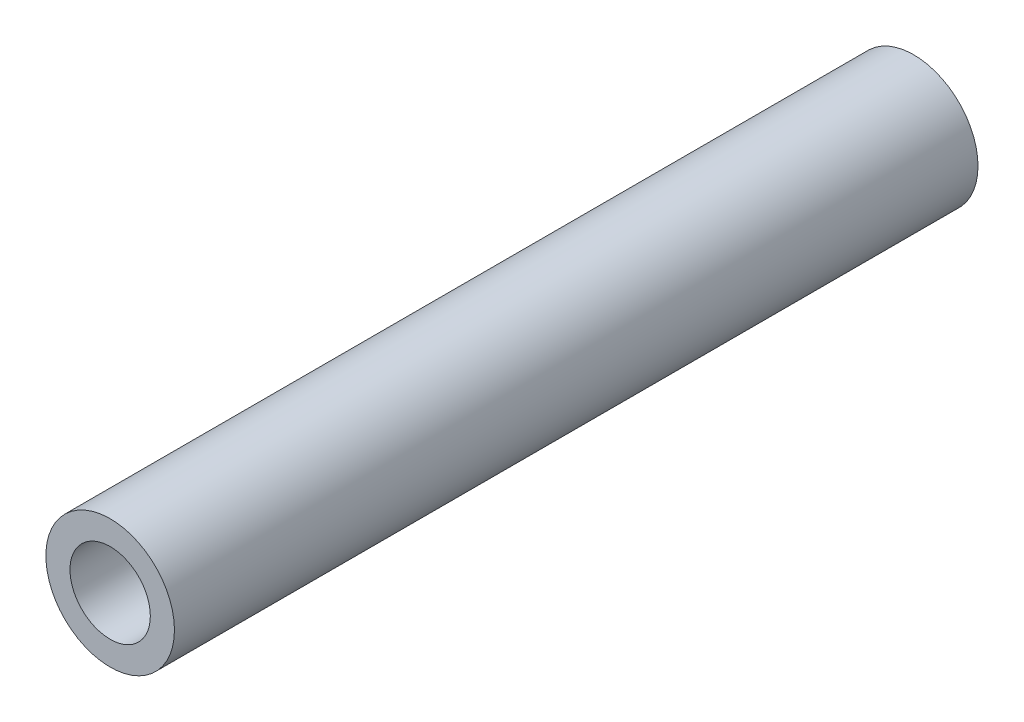
ISO-10303-21;
HEADER;
FILE_DESCRIPTION(('STEP AP214'),'2;1');
FILE_NAME('part.step','',(''),(''),'','','');
FILE_SCHEMA(('AUTOMOTIVE_DESIGN { 1 0 10303 214 1 1 1 1 }'));
ENDSEC;
DATA;
#1=APPLICATION_CONTEXT('core data for automotive mechanical design processes');
#2=APPLICATION_PROTOCOL_DEFINITION('international standard','automotive_design',2000,#1);
#3=PRODUCT_CONTEXT('',#1,'mechanical');
#4=PRODUCT('Part','Part','',(#3));
#5=PRODUCT_RELATED_PRODUCT_CATEGORY('part','',(#4));
#6=PRODUCT_DEFINITION_FORMATION('','',#4);
#7=PRODUCT_DEFINITION_CONTEXT('part definition',#1,'design');
#8=PRODUCT_DEFINITION('design','',#6,#7);
#9=PRODUCT_DEFINITION_SHAPE('','',#8);
#10=(LENGTH_UNIT() NAMED_UNIT(*) SI_UNIT(.MILLI.,.METRE.));
#11=(NAMED_UNIT(*) PLANE_ANGLE_UNIT() SI_UNIT($,.RADIAN.));
#12=(NAMED_UNIT(*) SI_UNIT($,.STERADIAN.) SOLID_ANGLE_UNIT());
#13=UNCERTAINTY_MEASURE_WITH_UNIT(LENGTH_MEASURE(1.E-05),#10,'distance_accuracy_value','');
#14=(GEOMETRIC_REPRESENTATION_CONTEXT(3) GLOBAL_UNCERTAINTY_ASSIGNED_CONTEXT((#13)) GLOBAL_UNIT_ASSIGNED_CONTEXT((#10,
#11,#12)) REPRESENTATION_CONTEXT('',''));
#15=CARTESIAN_POINT('',(0.,0.,0.));
#16=DIRECTION('',(0.,0.,1.));
#17=DIRECTION('',(1.,0.,0.));
#18=AXIS2_PLACEMENT_3D('',#15,#16,#17);
#19=CARTESIAN_POINT('',(0.,0.,25.));
#20=DIRECTION('',(0.,0.,1.));
#21=DIRECTION('',(1.,0.,0.));
#22=AXIS2_PLACEMENT_3D('',#19,#20,#21);
#23=PLANE('',#22);
#24=CARTESIAN_POINT('',(0.,0.,25.));
#25=DIRECTION('',(0.,0.,1.));
#26=DIRECTION('',(1.,0.,0.));
#27=AXIS2_PLACEMENT_3D('',#24,#25,#26);
#28=CIRCLE('',#27,2.);
#29=CARTESIAN_POINT('',(2.,0.,25.));
#30=VERTEX_POINT('',#29);
#31=EDGE_CURVE('E10',#30,#30,#28,.T.);
#32=ORIENTED_EDGE('',*,*,#31,.T.);
#33=EDGE_LOOP('',(#32));
#34=FACE_BOUND('',#33,.T.);
#35=CARTESIAN_POINT('',(0.,0.,25.));
#36=DIRECTION('',(0.,0.,1.));
#37=DIRECTION('',(1.,0.,0.));
#38=AXIS2_PLACEMENT_3D('',#35,#36,#37);
#39=CIRCLE('',#38,1.25);
#40=CARTESIAN_POINT('',(1.25,0.,25.));
#41=VERTEX_POINT('',#40);
#42=EDGE_CURVE('E53',#41,#41,#39,.T.);
#43=ORIENTED_EDGE('',*,*,#42,.F.);
#44=EDGE_LOOP('',(#43));
#45=FACE_BOUND('',#44,.T.);
#46=ADVANCED_FACE('F40',(#34,#45),#23,.T.);
#47=CARTESIAN_POINT('',(0.,0.,0.));
#48=DIRECTION('',(0.,0.,1.));
#49=DIRECTION('',(1.,0.,0.));
#50=AXIS2_PLACEMENT_3D('',#47,#48,#49);
#51=PLANE('',#50);
#52=CARTESIAN_POINT('',(0.,0.,0.));
#53=DIRECTION('',(0.,0.,1.));
#54=DIRECTION('',(1.,0.,0.));
#55=AXIS2_PLACEMENT_3D('',#52,#53,#54);
#56=CIRCLE('',#55,2.);
#57=CARTESIAN_POINT('',(2.,0.,0.));
#58=VERTEX_POINT('',#57);
#59=EDGE_CURVE('E44',#58,#58,#56,.T.);
#60=ORIENTED_EDGE('',*,*,#59,.F.);
#61=EDGE_LOOP('',(#60));
#62=FACE_BOUND('',#61,.T.);
#63=CARTESIAN_POINT('',(0.,0.,0.));
#64=DIRECTION('',(0.,0.,1.));
#65=DIRECTION('',(1.,0.,0.));
#66=AXIS2_PLACEMENT_3D('',#63,#64,#65);
#67=CIRCLE('',#66,1.25);
#68=CARTESIAN_POINT('',(1.25,0.,0.));
#69=VERTEX_POINT('',#68);
#70=EDGE_CURVE('E55',#69,#69,#67,.T.);
#71=ORIENTED_EDGE('',*,*,#70,.T.);
#72=EDGE_LOOP('',(#71));
#73=FACE_BOUND('',#72,.T.);
#74=ADVANCED_FACE('F67',(#62,#73),#51,.F.);
#75=CARTESIAN_POINT('',(0.,0.,25.));
#76=DIRECTION('',(0.,0.,-1.));
#77=DIRECTION('',(-1.,0.,0.));
#78=AXIS2_PLACEMENT_3D('',#75,#76,#77);
#79=CYLINDRICAL_SURFACE('',#78,2.);
#80=ORIENTED_EDGE('',*,*,#31,.F.);
#81=EDGE_LOOP('',(#80));
#82=FACE_BOUND('',#81,.T.);
#83=ORIENTED_EDGE('',*,*,#59,.T.);
#84=EDGE_LOOP('',(#83));
#85=FACE_BOUND('',#84,.T.);
#86=ADVANCED_FACE('F42',(#82,#85),#79,.T.);
#87=CARTESIAN_POINT('',(0.,0.,25.));
#88=DIRECTION('',(0.,0.,-1.));
#89=DIRECTION('',(-1.,0.,0.));
#90=AXIS2_PLACEMENT_3D('',#87,#88,#89);
#91=CYLINDRICAL_SURFACE('',#90,1.25);
#92=ORIENTED_EDGE('',*,*,#42,.T.);
#93=EDGE_LOOP('',(#92));
#94=FACE_BOUND('',#93,.T.);
#95=ORIENTED_EDGE('',*,*,#70,.F.);
#96=EDGE_LOOP('',(#95));
#97=FACE_BOUND('',#96,.T.);
#98=ADVANCED_FACE('F63',(#94,#97),#91,.F.);
#99=CLOSED_SHELL('',(#46,#74,#86,#98));
#100=MANIFOLD_SOLID_BREP('B2',#99);
#101=ADVANCED_BREP_SHAPE_REPRESENTATION('',(#18,#100),#14);
#102=SHAPE_DEFINITION_REPRESENTATION(#9,#101);
ENDSEC;
END-ISO-10303-21;
